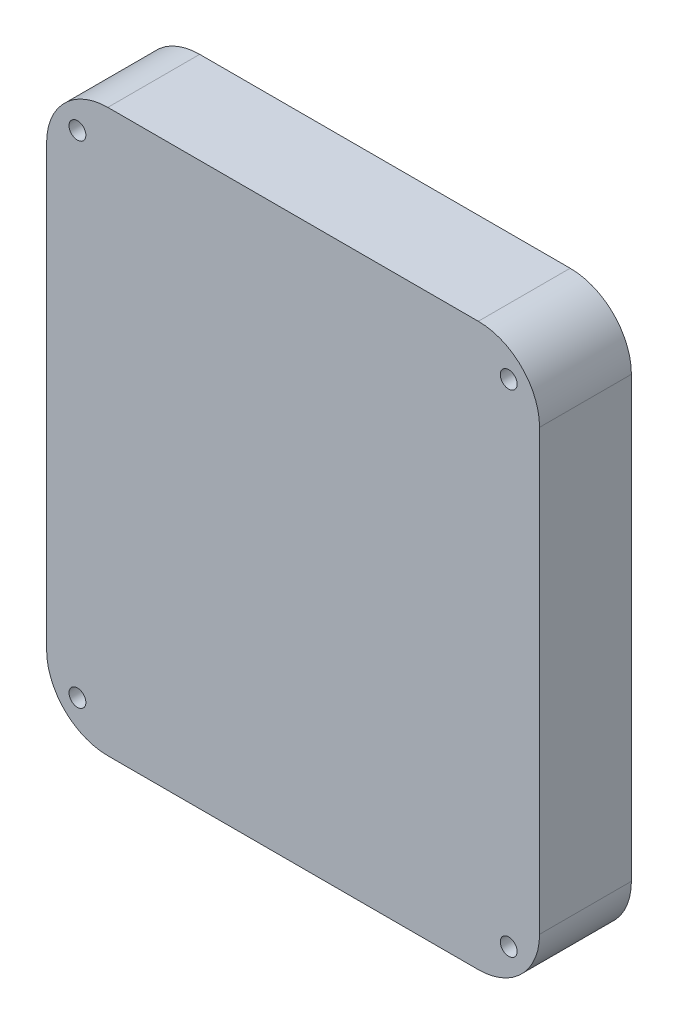
ISO-10303-21;
HEADER;
FILE_DESCRIPTION(('STEP AP214'),'2;1');
FILE_NAME('part.step','',(''),(''),'','','');
FILE_SCHEMA(('AUTOMOTIVE_DESIGN { 1 0 10303 214 1 1 1 1 }'));
ENDSEC;
DATA;
#1=APPLICATION_CONTEXT('core data for automotive mechanical design processes');
#2=APPLICATION_PROTOCOL_DEFINITION('international standard','automotive_design',2000,#1);
#3=PRODUCT_CONTEXT('',#1,'mechanical');
#4=PRODUCT('Part','Part','',(#3));
#5=PRODUCT_RELATED_PRODUCT_CATEGORY('part','',(#4));
#6=PRODUCT_DEFINITION_FORMATION('','',#4);
#7=PRODUCT_DEFINITION_CONTEXT('part definition',#1,'design');
#8=PRODUCT_DEFINITION('design','',#6,#7);
#9=PRODUCT_DEFINITION_SHAPE('','',#8);
#10=(LENGTH_UNIT() NAMED_UNIT(*) SI_UNIT(.MILLI.,.METRE.));
#11=(NAMED_UNIT(*) PLANE_ANGLE_UNIT() SI_UNIT($,.RADIAN.));
#12=(NAMED_UNIT(*) SI_UNIT($,.STERADIAN.) SOLID_ANGLE_UNIT());
#13=UNCERTAINTY_MEASURE_WITH_UNIT(LENGTH_MEASURE(1.E-05),#10,'distance_accuracy_value','');
#14=(GEOMETRIC_REPRESENTATION_CONTEXT(3) GLOBAL_UNCERTAINTY_ASSIGNED_CONTEXT((#13)) GLOBAL_UNIT_ASSIGNED_CONTEXT((#10,
#11,#12)) REPRESENTATION_CONTEXT('',''));
#15=CARTESIAN_POINT('',(0.,0.,0.));
#16=DIRECTION('',(0.,0.,1.));
#17=DIRECTION('',(1.,0.,0.));
#18=AXIS2_PLACEMENT_3D('',#15,#16,#17);
#19=CARTESIAN_POINT('',(40.25,45.85,15.));
#20=DIRECTION('',(-1.,0.,0.));
#21=DIRECTION('',(0.,-1.,0.));
#22=AXIS2_PLACEMENT_3D('',#19,#20,#21);
#23=PLANE('',#22);
#24=DIRECTION('',(0.,1.,0.));
#25=VECTOR('',#24,1.);
#26=CARTESIAN_POINT('',(40.25,45.85,15.));
#27=LINE('',#26,#25);
#28=CARTESIAN_POINT('',(40.25,-35.85,15.));
#29=VERTEX_POINT('',#28);
#30=CARTESIAN_POINT('',(40.25,35.85,15.));
#31=VERTEX_POINT('',#30);
#32=EDGE_CURVE('E126',#29,#31,#27,.T.);
#33=ORIENTED_EDGE('',*,*,#32,.F.);
#34=DIRECTION('',(0.,0.,-1.));
#35=VECTOR('',#34,1.);
#36=CARTESIAN_POINT('',(40.25,-35.85,15.));
#37=LINE('',#36,#35);
#38=CARTESIAN_POINT('',(40.25,-35.85,0.));
#39=VERTEX_POINT('',#38);
#40=EDGE_CURVE('E152',#29,#39,#37,.T.);
#41=ORIENTED_EDGE('',*,*,#40,.T.);
#42=DIRECTION('',(0.,1.,0.));
#43=VECTOR('',#42,1.);
#44=CARTESIAN_POINT('',(40.25,45.85,0.));
#45=LINE('',#44,#43);
#46=CARTESIAN_POINT('',(40.25,35.85,0.));
#47=VERTEX_POINT('',#46);
#48=EDGE_CURVE('E160',#39,#47,#45,.T.);
#49=ORIENTED_EDGE('',*,*,#48,.T.);
#50=DIRECTION('',(0.,0.,-1.));
#51=VECTOR('',#50,1.);
#52=CARTESIAN_POINT('',(40.25,35.85,15.));
#53=LINE('',#52,#51);
#54=EDGE_CURVE('E150',#47,#31,#53,.F.);
#55=ORIENTED_EDGE('',*,*,#54,.T.);
#56=EDGE_LOOP('',(#33,#41,#49,#55));
#57=FACE_BOUND('',#56,.T.);
#58=ADVANCED_FACE('F35',(#57),#23,.F.);
#59=CARTESIAN_POINT('',(-40.25,45.85,15.));
#60=DIRECTION('',(0.,-1.,0.));
#61=DIRECTION('',(0.,0.,-1.));
#62=AXIS2_PLACEMENT_3D('',#59,#60,#61);
#63=PLANE('',#62);
#64=DIRECTION('',(-1.,0.,0.));
#65=VECTOR('',#64,1.);
#66=CARTESIAN_POINT('',(-40.25,45.85,0.));
#67=LINE('',#66,#65);
#68=CARTESIAN_POINT('',(30.25,45.85,0.));
#69=VERTEX_POINT('',#68);
#70=CARTESIAN_POINT('',(-30.25,45.85,0.));
#71=VERTEX_POINT('',#70);
#72=EDGE_CURVE('E131',#69,#71,#67,.T.);
#73=ORIENTED_EDGE('',*,*,#72,.T.);
#74=DIRECTION('',(0.,0.,-1.));
#75=VECTOR('',#74,1.);
#76=CARTESIAN_POINT('',(-30.25,45.85,15.));
#77=LINE('',#76,#75);
#78=CARTESIAN_POINT('',(-30.25,45.85,15.));
#79=VERTEX_POINT('',#78);
#80=EDGE_CURVE('E11',#71,#79,#77,.F.);
#81=ORIENTED_EDGE('',*,*,#80,.T.);
#82=DIRECTION('',(-1.,0.,0.));
#83=VECTOR('',#82,1.);
#84=CARTESIAN_POINT('',(-40.25,45.85,15.));
#85=LINE('',#84,#83);
#86=CARTESIAN_POINT('',(30.25,45.85,15.));
#87=VERTEX_POINT('',#86);
#88=EDGE_CURVE('E129',#87,#79,#85,.T.);
#89=ORIENTED_EDGE('',*,*,#88,.F.);
#90=DIRECTION('',(0.,0.,-1.));
#91=VECTOR('',#90,1.);
#92=CARTESIAN_POINT('',(30.25,45.85,15.));
#93=LINE('',#92,#91);
#94=EDGE_CURVE('E43',#87,#69,#93,.T.);
#95=ORIENTED_EDGE('',*,*,#94,.T.);
#96=EDGE_LOOP('',(#73,#81,#89,#95));
#97=FACE_BOUND('',#96,.T.);
#98=ADVANCED_FACE('F157',(#97),#63,.F.);
#99=CARTESIAN_POINT('',(-40.25,45.85,15.));
#100=DIRECTION('',(1.,0.,0.));
#101=DIRECTION('',(0.,1.,0.));
#102=AXIS2_PLACEMENT_3D('',#99,#100,#101);
#103=PLANE('',#102);
#104=DIRECTION('',(0.,-1.,0.));
#105=VECTOR('',#104,1.);
#106=CARTESIAN_POINT('',(-40.25,45.85,0.));
#107=LINE('',#106,#105);
#108=CARTESIAN_POINT('',(-40.25,35.85,0.));
#109=VERTEX_POINT('',#108);
#110=CARTESIAN_POINT('',(-40.25,-35.85,0.));
#111=VERTEX_POINT('',#110);
#112=EDGE_CURVE('E127',#109,#111,#107,.T.);
#113=ORIENTED_EDGE('',*,*,#112,.T.);
#114=DIRECTION('',(0.,0.,-1.));
#115=VECTOR('',#114,1.);
#116=CARTESIAN_POINT('',(-40.25,-35.85,15.));
#117=LINE('',#116,#115);
#118=CARTESIAN_POINT('',(-40.25,-35.85,15.));
#119=VERTEX_POINT('',#118);
#120=EDGE_CURVE('E105',#111,#119,#117,.F.);
#121=ORIENTED_EDGE('',*,*,#120,.T.);
#122=DIRECTION('',(0.,-1.,0.));
#123=VECTOR('',#122,1.);
#124=CARTESIAN_POINT('',(-40.25,45.85,15.));
#125=LINE('',#124,#123);
#126=CARTESIAN_POINT('',(-40.25,35.85,15.));
#127=VERTEX_POINT('',#126);
#128=EDGE_CURVE('E165',#127,#119,#125,.T.);
#129=ORIENTED_EDGE('',*,*,#128,.F.);
#130=DIRECTION('',(0.,0.,-1.));
#131=VECTOR('',#130,1.);
#132=CARTESIAN_POINT('',(-40.25,35.85,15.));
#133=LINE('',#132,#131);
#134=EDGE_CURVE('E110',#127,#109,#133,.T.);
#135=ORIENTED_EDGE('',*,*,#134,.T.);
#136=EDGE_LOOP('',(#113,#121,#129,#135));
#137=FACE_BOUND('',#136,.T.);
#138=ADVANCED_FACE('F215',(#137),#103,.F.);
#139=CARTESIAN_POINT('',(-40.25,-45.85,15.));
#140=DIRECTION('',(0.,1.,0.));
#141=DIRECTION('',(0.,0.,1.));
#142=AXIS2_PLACEMENT_3D('',#139,#140,#141);
#143=PLANE('',#142);
#144=DIRECTION('',(1.,0.,0.));
#145=VECTOR('',#144,1.);
#146=CARTESIAN_POINT('',(-40.25,-45.85,15.));
#147=LINE('',#146,#145);
#148=CARTESIAN_POINT('',(-30.25,-45.85,15.));
#149=VERTEX_POINT('',#148);
#150=CARTESIAN_POINT('',(30.25,-45.85,15.));
#151=VERTEX_POINT('',#150);
#152=EDGE_CURVE('E120',#149,#151,#147,.T.);
#153=ORIENTED_EDGE('',*,*,#152,.F.);
#154=DIRECTION('',(0.,0.,-1.));
#155=VECTOR('',#154,1.);
#156=CARTESIAN_POINT('',(-30.25,-45.85,15.));
#157=LINE('',#156,#155);
#158=CARTESIAN_POINT('',(-30.25,-45.85,0.));
#159=VERTEX_POINT('',#158);
#160=EDGE_CURVE('E104',#149,#159,#157,.T.);
#161=ORIENTED_EDGE('',*,*,#160,.T.);
#162=DIRECTION('',(1.,0.,0.));
#163=VECTOR('',#162,1.);
#164=CARTESIAN_POINT('',(-40.25,-45.85,0.));
#165=LINE('',#164,#163);
#166=CARTESIAN_POINT('',(30.25,-45.85,0.));
#167=VERTEX_POINT('',#166);
#168=EDGE_CURVE('E117',#159,#167,#165,.T.);
#169=ORIENTED_EDGE('',*,*,#168,.T.);
#170=DIRECTION('',(0.,0.,-1.));
#171=VECTOR('',#170,1.);
#172=CARTESIAN_POINT('',(30.25,-45.85,15.));
#173=LINE('',#172,#171);
#174=EDGE_CURVE('E122',#167,#151,#173,.F.);
#175=ORIENTED_EDGE('',*,*,#174,.T.);
#176=EDGE_LOOP('',(#153,#161,#169,#175));
#177=FACE_BOUND('',#176,.T.);
#178=ADVANCED_FACE('F116',(#177),#143,.F.);
#179=CARTESIAN_POINT('',(0.,0.,15.));
#180=DIRECTION('',(0.,0.,1.));
#181=DIRECTION('',(1.,0.,0.));
#182=AXIS2_PLACEMENT_3D('',#179,#180,#181);
#183=PLANE('',#182);
#184=CARTESIAN_POINT('',(35.2126704010132,40.1118245437628,15.));
#185=DIRECTION('',(0.,0.,1.));
#186=DIRECTION('',(1.,0.,0.));
#187=AXIS2_PLACEMENT_3D('',#184,#185,#186);
#188=CIRCLE('',#187,1.375);
#189=CARTESIAN_POINT('',(36.5876704010132,40.1118245437628,15.));
#190=VERTEX_POINT('',#189);
#191=EDGE_CURVE('E187',#190,#190,#188,.T.);
#192=ORIENTED_EDGE('',*,*,#191,.F.);
#193=EDGE_LOOP('',(#192));
#194=FACE_BOUND('',#193,.T.);
#195=CARTESIAN_POINT('',(35.2126704010131,-40.1118245437628,15.));
#196=DIRECTION('',(0.,0.,1.));
#197=DIRECTION('',(1.,0.,0.));
#198=AXIS2_PLACEMENT_3D('',#195,#196,#197);
#199=CIRCLE('',#198,1.375);
#200=CARTESIAN_POINT('',(36.5876704010131,-40.1118245437628,15.));
#201=VERTEX_POINT('',#200);
#202=EDGE_CURVE('E181',#201,#201,#199,.T.);
#203=ORIENTED_EDGE('',*,*,#202,.F.);
#204=EDGE_LOOP('',(#203));
#205=FACE_BOUND('',#204,.T.);
#206=CARTESIAN_POINT('',(-35.2126704010131,-40.1118245437628,15.));
#207=DIRECTION('',(0.,0.,1.));
#208=DIRECTION('',(1.,0.,0.));
#209=AXIS2_PLACEMENT_3D('',#206,#207,#208);
#210=CIRCLE('',#209,1.375);
#211=CARTESIAN_POINT('',(-33.8376704010131,-40.1118245437628,15.));
#212=VERTEX_POINT('',#211);
#213=EDGE_CURVE('E175',#212,#212,#210,.T.);
#214=ORIENTED_EDGE('',*,*,#213,.F.);
#215=EDGE_LOOP('',(#214));
#216=FACE_BOUND('',#215,.T.);
#217=CARTESIAN_POINT('',(-35.2126704010132,40.1118245437628,15.));
#218=DIRECTION('',(0.,0.,1.));
#219=DIRECTION('',(1.,0.,0.));
#220=AXIS2_PLACEMENT_3D('',#217,#218,#219);
#221=CIRCLE('',#220,1.375);
#222=CARTESIAN_POINT('',(-33.8376704010132,40.1118245437628,15.));
#223=VERTEX_POINT('',#222);
#224=EDGE_CURVE('E169',#223,#223,#221,.T.);
#225=ORIENTED_EDGE('',*,*,#224,.F.);
#226=EDGE_LOOP('',(#225));
#227=FACE_BOUND('',#226,.T.);
#228=ORIENTED_EDGE('',*,*,#128,.T.);
#229=CARTESIAN_POINT('',(-30.25,-35.85,15.));
#230=DIRECTION('',(0.,0.,1.));
#231=DIRECTION('',(1.,0.,0.));
#232=AXIS2_PLACEMENT_3D('',#229,#230,#231);
#233=CIRCLE('',#232,10.);
#234=EDGE_CURVE('E148',#119,#149,#233,.T.);
#235=ORIENTED_EDGE('',*,*,#234,.T.);
#236=ORIENTED_EDGE('',*,*,#152,.T.);
#237=CARTESIAN_POINT('',(30.25,-35.85,15.));
#238=DIRECTION('',(0.,0.,1.));
#239=DIRECTION('',(1.,0.,0.));
#240=AXIS2_PLACEMENT_3D('',#237,#238,#239);
#241=CIRCLE('',#240,10.);
#242=EDGE_CURVE('E146',#151,#29,#241,.T.);
#243=ORIENTED_EDGE('',*,*,#242,.T.);
#244=ORIENTED_EDGE('',*,*,#32,.T.);
#245=CARTESIAN_POINT('',(30.25,35.85,15.));
#246=DIRECTION('',(0.,0.,1.));
#247=DIRECTION('',(1.,0.,0.));
#248=AXIS2_PLACEMENT_3D('',#245,#246,#247);
#249=CIRCLE('',#248,10.);
#250=EDGE_CURVE('E55',#31,#87,#249,.T.);
#251=ORIENTED_EDGE('',*,*,#250,.T.);
#252=ORIENTED_EDGE('',*,*,#88,.T.);
#253=CARTESIAN_POINT('',(-30.25,35.85,15.));
#254=DIRECTION('',(0.,0.,1.));
#255=DIRECTION('',(1.,0.,0.));
#256=AXIS2_PLACEMENT_3D('',#253,#254,#255);
#257=CIRCLE('',#256,10.);
#258=EDGE_CURVE('E144',#79,#127,#257,.T.);
#259=ORIENTED_EDGE('',*,*,#258,.T.);
#260=EDGE_LOOP('',(#228,#235,#236,#243,#244,#251,#252,#259));
#261=FACE_BOUND('',#260,.T.);
#262=ADVANCED_FACE('F202',(#194,#205,#216,#227,#261),#183,.T.);
#263=CARTESIAN_POINT('',(0.,0.,0.));
#264=DIRECTION('',(0.,0.,1.));
#265=DIRECTION('',(1.,0.,0.));
#266=AXIS2_PLACEMENT_3D('',#263,#264,#265);
#267=PLANE('',#266);
#268=CARTESIAN_POINT('',(35.2126704010132,40.1118245437628,0.));
#269=DIRECTION('',(0.,0.,1.));
#270=DIRECTION('',(1.,0.,0.));
#271=AXIS2_PLACEMENT_3D('',#268,#269,#270);
#272=CIRCLE('',#271,1.375);
#273=CARTESIAN_POINT('',(36.5876704010132,40.1118245437628,0.));
#274=VERTEX_POINT('',#273);
#275=EDGE_CURVE('E172',#274,#274,#272,.T.);
#276=ORIENTED_EDGE('',*,*,#275,.T.);
#277=EDGE_LOOP('',(#276));
#278=FACE_BOUND('',#277,.T.);
#279=CARTESIAN_POINT('',(35.2126704010131,-40.1118245437628,0.));
#280=DIRECTION('',(0.,0.,1.));
#281=DIRECTION('',(1.,0.,0.));
#282=AXIS2_PLACEMENT_3D('',#279,#280,#281);
#283=CIRCLE('',#282,1.375);
#284=CARTESIAN_POINT('',(36.5876704010131,-40.1118245437628,0.));
#285=VERTEX_POINT('',#284);
#286=EDGE_CURVE('E184',#285,#285,#283,.T.);
#287=ORIENTED_EDGE('',*,*,#286,.T.);
#288=EDGE_LOOP('',(#287));
#289=FACE_BOUND('',#288,.T.);
#290=CARTESIAN_POINT('',(-35.2126704010131,-40.1118245437628,0.));
#291=DIRECTION('',(0.,0.,1.));
#292=DIRECTION('',(1.,0.,0.));
#293=AXIS2_PLACEMENT_3D('',#290,#291,#292);
#294=CIRCLE('',#293,1.375);
#295=CARTESIAN_POINT('',(-33.8376704010131,-40.1118245437628,0.));
#296=VERTEX_POINT('',#295);
#297=EDGE_CURVE('E178',#296,#296,#294,.T.);
#298=ORIENTED_EDGE('',*,*,#297,.T.);
#299=EDGE_LOOP('',(#298));
#300=FACE_BOUND('',#299,.T.);
#301=CARTESIAN_POINT('',(-35.2126704010132,40.1118245437628,0.));
#302=DIRECTION('',(0.,0.,1.));
#303=DIRECTION('',(1.,0.,0.));
#304=AXIS2_PLACEMENT_3D('',#301,#302,#303);
#305=CIRCLE('',#304,1.375);
#306=CARTESIAN_POINT('',(-33.8376704010132,40.1118245437628,0.));
#307=VERTEX_POINT('',#306);
#308=EDGE_CURVE('E161',#307,#307,#305,.T.);
#309=ORIENTED_EDGE('',*,*,#308,.T.);
#310=EDGE_LOOP('',(#309));
#311=FACE_BOUND('',#310,.T.);
#312=ORIENTED_EDGE('',*,*,#168,.F.);
#313=CARTESIAN_POINT('',(-30.25,-35.85,0.));
#314=DIRECTION('',(0.,0.,1.));
#315=DIRECTION('',(1.,0.,0.));
#316=AXIS2_PLACEMENT_3D('',#313,#314,#315);
#317=CIRCLE('',#316,10.);
#318=EDGE_CURVE('E100',#159,#111,#317,.F.);
#319=ORIENTED_EDGE('',*,*,#318,.T.);
#320=ORIENTED_EDGE('',*,*,#112,.F.);
#321=CARTESIAN_POINT('',(-30.25,35.85,0.));
#322=DIRECTION('',(0.,0.,1.));
#323=DIRECTION('',(1.,0.,0.));
#324=AXIS2_PLACEMENT_3D('',#321,#322,#323);
#325=CIRCLE('',#324,10.);
#326=EDGE_CURVE('E137',#109,#71,#325,.F.);
#327=ORIENTED_EDGE('',*,*,#326,.T.);
#328=ORIENTED_EDGE('',*,*,#72,.F.);
#329=CARTESIAN_POINT('',(30.25,35.85,0.));
#330=DIRECTION('',(0.,0.,1.));
#331=DIRECTION('',(1.,0.,0.));
#332=AXIS2_PLACEMENT_3D('',#329,#330,#331);
#333=CIRCLE('',#332,10.);
#334=EDGE_CURVE('E121',#69,#47,#333,.F.);
#335=ORIENTED_EDGE('',*,*,#334,.T.);
#336=ORIENTED_EDGE('',*,*,#48,.F.);
#337=CARTESIAN_POINT('',(30.25,-35.85,0.));
#338=DIRECTION('',(0.,0.,1.));
#339=DIRECTION('',(1.,0.,0.));
#340=AXIS2_PLACEMENT_3D('',#337,#338,#339);
#341=CIRCLE('',#340,10.);
#342=EDGE_CURVE('E111',#39,#167,#341,.F.);
#343=ORIENTED_EDGE('',*,*,#342,.T.);
#344=EDGE_LOOP('',(#312,#319,#320,#327,#328,#335,#336,#343));
#345=FACE_BOUND('',#344,.T.);
#346=ADVANCED_FACE('F124',(#278,#289,#300,#311,#345),#267,.F.);
#347=CARTESIAN_POINT('',(-30.25,-35.85,15.));
#348=DIRECTION('',(0.,0.,-1.));
#349=DIRECTION('',(-1.,0.,0.));
#350=AXIS2_PLACEMENT_3D('',#347,#348,#349);
#351=CYLINDRICAL_SURFACE('',#350,10.);
#352=ORIENTED_EDGE('',*,*,#234,.F.);
#353=ORIENTED_EDGE('',*,*,#120,.F.);
#354=ORIENTED_EDGE('',*,*,#318,.F.);
#355=ORIENTED_EDGE('',*,*,#160,.F.);
#356=EDGE_LOOP('',(#352,#353,#354,#355));
#357=FACE_BOUND('',#356,.T.);
#358=ADVANCED_FACE('F103',(#357),#351,.T.);
#359=CARTESIAN_POINT('',(30.25,-35.85,15.));
#360=DIRECTION('',(0.,0.,-1.));
#361=DIRECTION('',(-1.,0.,0.));
#362=AXIS2_PLACEMENT_3D('',#359,#360,#361);
#363=CYLINDRICAL_SURFACE('',#362,10.);
#364=ORIENTED_EDGE('',*,*,#242,.F.);
#365=ORIENTED_EDGE('',*,*,#174,.F.);
#366=ORIENTED_EDGE('',*,*,#342,.F.);
#367=ORIENTED_EDGE('',*,*,#40,.F.);
#368=EDGE_LOOP('',(#364,#365,#366,#367));
#369=FACE_BOUND('',#368,.T.);
#370=ADVANCED_FACE('F219',(#369),#363,.T.);
#371=CARTESIAN_POINT('',(-30.25,35.85,15.));
#372=DIRECTION('',(0.,0.,-1.));
#373=DIRECTION('',(-1.,0.,0.));
#374=AXIS2_PLACEMENT_3D('',#371,#372,#373);
#375=CYLINDRICAL_SURFACE('',#374,10.);
#376=ORIENTED_EDGE('',*,*,#258,.F.);
#377=ORIENTED_EDGE('',*,*,#80,.F.);
#378=ORIENTED_EDGE('',*,*,#326,.F.);
#379=ORIENTED_EDGE('',*,*,#134,.F.);
#380=EDGE_LOOP('',(#376,#377,#378,#379));
#381=FACE_BOUND('',#380,.T.);
#382=ADVANCED_FACE('F217',(#381),#375,.T.);
#383=CARTESIAN_POINT('',(30.25,35.85,15.));
#384=DIRECTION('',(0.,0.,-1.));
#385=DIRECTION('',(-1.,0.,0.));
#386=AXIS2_PLACEMENT_3D('',#383,#384,#385);
#387=CYLINDRICAL_SURFACE('',#386,10.);
#388=ORIENTED_EDGE('',*,*,#250,.F.);
#389=ORIENTED_EDGE('',*,*,#54,.F.);
#390=ORIENTED_EDGE('',*,*,#334,.F.);
#391=ORIENTED_EDGE('',*,*,#94,.F.);
#392=EDGE_LOOP('',(#388,#389,#390,#391));
#393=FACE_BOUND('',#392,.T.);
#394=ADVANCED_FACE('F37',(#393),#387,.T.);
#395=CARTESIAN_POINT('',(-35.2126704010132,40.1118245437628,0.));
#396=DIRECTION('',(0.,0.,1.));
#397=DIRECTION('',(1.,0.,0.));
#398=AXIS2_PLACEMENT_3D('',#395,#396,#397);
#399=CYLINDRICAL_SURFACE('',#398,1.375);
#400=ORIENTED_EDGE('',*,*,#308,.F.);
#401=EDGE_LOOP('',(#400));
#402=FACE_BOUND('',#401,.T.);
#403=ORIENTED_EDGE('',*,*,#224,.T.);
#404=EDGE_LOOP('',(#403));
#405=FACE_BOUND('',#404,.T.);
#406=ADVANCED_FACE('F224',(#402,#405),#399,.F.);
#407=CARTESIAN_POINT('',(-35.2126704010131,-40.1118245437628,0.));
#408=DIRECTION('',(0.,0.,1.));
#409=DIRECTION('',(1.,0.,0.));
#410=AXIS2_PLACEMENT_3D('',#407,#408,#409);
#411=CYLINDRICAL_SURFACE('',#410,1.375);
#412=ORIENTED_EDGE('',*,*,#297,.F.);
#413=EDGE_LOOP('',(#412));
#414=FACE_BOUND('',#413,.T.);
#415=ORIENTED_EDGE('',*,*,#213,.T.);
#416=EDGE_LOOP('',(#415));
#417=FACE_BOUND('',#416,.T.);
#418=ADVANCED_FACE('F279',(#414,#417),#411,.F.);
#419=CARTESIAN_POINT('',(35.2126704010131,-40.1118245437628,0.));
#420=DIRECTION('',(0.,0.,1.));
#421=DIRECTION('',(1.,0.,0.));
#422=AXIS2_PLACEMENT_3D('',#419,#420,#421);
#423=CYLINDRICAL_SURFACE('',#422,1.375);
#424=ORIENTED_EDGE('',*,*,#286,.F.);
#425=EDGE_LOOP('',(#424));
#426=FACE_BOUND('',#425,.T.);
#427=ORIENTED_EDGE('',*,*,#202,.T.);
#428=EDGE_LOOP('',(#427));
#429=FACE_BOUND('',#428,.T.);
#430=ADVANCED_FACE('F198',(#426,#429),#423,.F.);
#431=CARTESIAN_POINT('',(35.2126704010132,40.1118245437628,0.));
#432=DIRECTION('',(0.,0.,1.));
#433=DIRECTION('',(1.,0.,0.));
#434=AXIS2_PLACEMENT_3D('',#431,#432,#433);
#435=CYLINDRICAL_SURFACE('',#434,1.375);
#436=ORIENTED_EDGE('',*,*,#275,.F.);
#437=EDGE_LOOP('',(#436));
#438=FACE_BOUND('',#437,.T.);
#439=ORIENTED_EDGE('',*,*,#191,.T.);
#440=EDGE_LOOP('',(#439));
#441=FACE_BOUND('',#440,.T.);
#442=ADVANCED_FACE('F195',(#438,#441),#435,.F.);
#443=CLOSED_SHELL('',(#58,#98,#138,#178,#262,#346,#358,#370,#382,#394,#406,#418,#430,#442));
#444=MANIFOLD_SOLID_BREP('B2',#443);
#445=ADVANCED_BREP_SHAPE_REPRESENTATION('',(#18,#444),#14);
#446=SHAPE_DEFINITION_REPRESENTATION(#9,#445);
ENDSEC;
END-ISO-10303-21;
